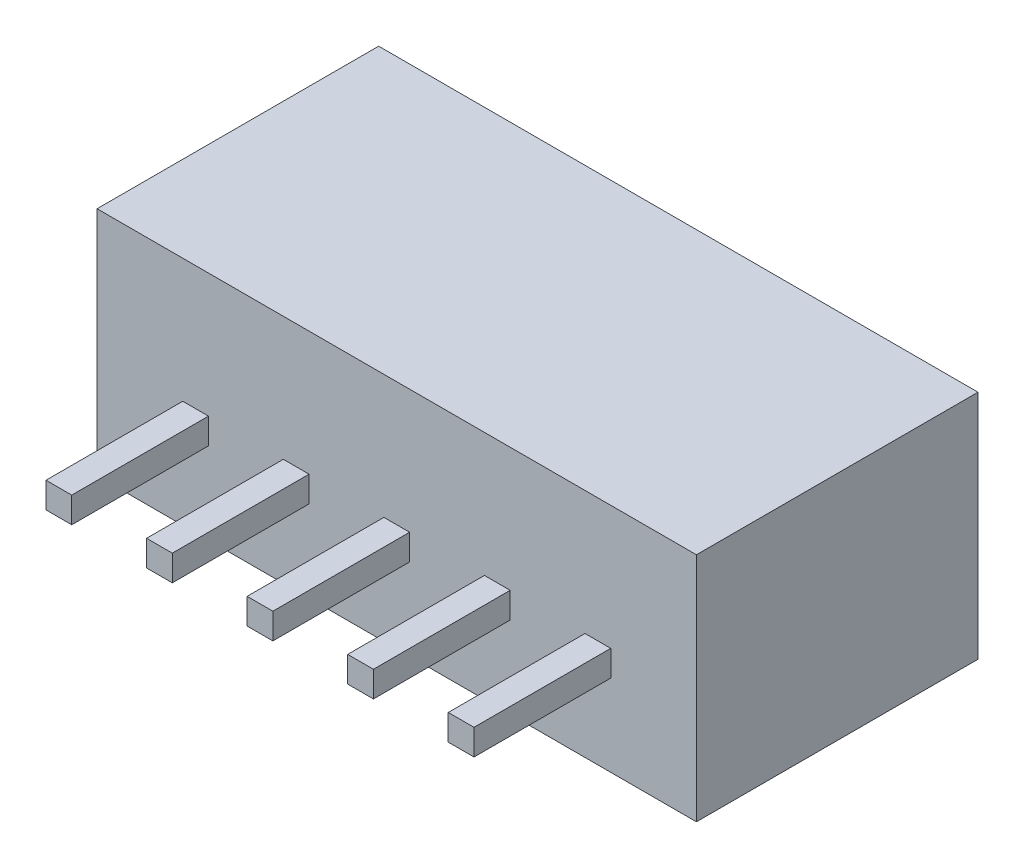
ISO-10303-21;
HEADER;
FILE_DESCRIPTION(('STEP AP214'),'2;1');
FILE_NAME('part.step','',(''),(''),'','','');
FILE_SCHEMA(('AUTOMOTIVE_DESIGN { 1 0 10303 214 1 1 1 1 }'));
ENDSEC;
DATA;
#1=APPLICATION_CONTEXT('core data for automotive mechanical design processes');
#2=APPLICATION_PROTOCOL_DEFINITION('international standard','automotive_design',2000,#1);
#3=PRODUCT_CONTEXT('',#1,'mechanical');
#4=PRODUCT('Part','Part','',(#3));
#5=PRODUCT_RELATED_PRODUCT_CATEGORY('part','',(#4));
#6=PRODUCT_DEFINITION_FORMATION('','',#4);
#7=PRODUCT_DEFINITION_CONTEXT('part definition',#1,'design');
#8=PRODUCT_DEFINITION('design','',#6,#7);
#9=PRODUCT_DEFINITION_SHAPE('','',#8);
#10=(LENGTH_UNIT() NAMED_UNIT(*) SI_UNIT(.MILLI.,.METRE.));
#11=(NAMED_UNIT(*) PLANE_ANGLE_UNIT() SI_UNIT($,.RADIAN.));
#12=(NAMED_UNIT(*) SI_UNIT($,.STERADIAN.) SOLID_ANGLE_UNIT());
#13=UNCERTAINTY_MEASURE_WITH_UNIT(LENGTH_MEASURE(1.E-05),#10,'distance_accuracy_value','');
#14=(GEOMETRIC_REPRESENTATION_CONTEXT(3) GLOBAL_UNCERTAINTY_ASSIGNED_CONTEXT((#13)) GLOBAL_UNIT_ASSIGNED_CONTEXT((#10,
#11,#12)) REPRESENTATION_CONTEXT('',''));
#15=CARTESIAN_POINT('',(0.,0.,0.));
#16=DIRECTION('',(0.,0.,1.));
#17=DIRECTION('',(1.,0.,0.));
#18=AXIS2_PLACEMENT_3D('',#15,#16,#17);
#19=CARTESIAN_POINT('',(0.,0.,7.));
#20=DIRECTION('',(0.,0.,1.));
#21=DIRECTION('',(1.,0.,0.));
#22=AXIS2_PLACEMENT_3D('',#19,#20,#21);
#23=PLANE('',#22);
#24=DIRECTION('',(-1.,0.,0.));
#25=VECTOR('',#24,1.);
#26=CARTESIAN_POINT('',(2.18,-0.204999999999995,7.));
#27=LINE('',#26,#25);
#28=CARTESIAN_POINT('',(2.82,-0.204999999999995,7.));
#29=VERTEX_POINT('',#28);
#30=CARTESIAN_POINT('',(2.18,-0.204999999999995,7.));
#31=VERTEX_POINT('',#30);
#32=EDGE_CURVE('E299',#29,#31,#27,.T.);
#33=ORIENTED_EDGE('',*,*,#32,.F.);
#34=DIRECTION('',(0.,1.,0.));
#35=VECTOR('',#34,1.);
#36=CARTESIAN_POINT('',(2.82,-0.204999999999995,7.));
#37=LINE('',#36,#35);
#38=CARTESIAN_POINT('',(2.82,-0.844999999999996,7.));
#39=VERTEX_POINT('',#38);
#40=EDGE_CURVE('E285',#39,#29,#37,.T.);
#41=ORIENTED_EDGE('',*,*,#40,.F.);
#42=DIRECTION('',(1.,0.,0.));
#43=VECTOR('',#42,1.);
#44=CARTESIAN_POINT('',(2.18,-0.844999999999996,7.));
#45=LINE('',#44,#43);
#46=CARTESIAN_POINT('',(2.18,-0.844999999999996,7.));
#47=VERTEX_POINT('',#46);
#48=EDGE_CURVE('E290',#47,#39,#45,.T.);
#49=ORIENTED_EDGE('',*,*,#48,.F.);
#50=DIRECTION('',(0.,-1.,0.));
#51=VECTOR('',#50,1.);
#52=CARTESIAN_POINT('',(2.18,-0.204999999999995,7.));
#53=LINE('',#52,#51);
#54=EDGE_CURVE('E301',#31,#47,#53,.T.);
#55=ORIENTED_EDGE('',*,*,#54,.F.);
#56=EDGE_LOOP('',(#33,#41,#49,#55));
#57=FACE_BOUND('',#56,.T.);
#58=DIRECTION('',(-1.,0.,0.));
#59=VECTOR('',#58,1.);
#60=CARTESIAN_POINT('',(-2.82,-0.204999999999995,7.));
#61=LINE('',#60,#59);
#62=CARTESIAN_POINT('',(-2.18,-0.204999999999995,7.));
#63=VERTEX_POINT('',#62);
#64=CARTESIAN_POINT('',(-2.82,-0.204999999999995,7.));
#65=VERTEX_POINT('',#64);
#66=EDGE_CURVE('E357',#63,#65,#61,.T.);
#67=ORIENTED_EDGE('',*,*,#66,.F.);
#68=DIRECTION('',(0.,1.,0.));
#69=VECTOR('',#68,1.);
#70=CARTESIAN_POINT('',(-2.18,-0.204999999999995,7.));
#71=LINE('',#70,#69);
#72=CARTESIAN_POINT('',(-2.18,-0.844999999999996,7.));
#73=VERTEX_POINT('',#72);
#74=EDGE_CURVE('E343',#73,#63,#71,.T.);
#75=ORIENTED_EDGE('',*,*,#74,.F.);
#76=DIRECTION('',(1.,0.,0.));
#77=VECTOR('',#76,1.);
#78=CARTESIAN_POINT('',(-2.82,-0.844999999999996,7.));
#79=LINE('',#78,#77);
#80=CARTESIAN_POINT('',(-2.82,-0.844999999999996,7.));
#81=VERTEX_POINT('',#80);
#82=EDGE_CURVE('E348',#81,#73,#79,.T.);
#83=ORIENTED_EDGE('',*,*,#82,.F.);
#84=DIRECTION('',(0.,-1.,0.));
#85=VECTOR('',#84,1.);
#86=CARTESIAN_POINT('',(-2.82,-0.204999999999995,7.));
#87=LINE('',#86,#85);
#88=EDGE_CURVE('E359',#65,#81,#87,.T.);
#89=ORIENTED_EDGE('',*,*,#88,.F.);
#90=EDGE_LOOP('',(#67,#75,#83,#89));
#91=FACE_BOUND('',#90,.T.);
#92=DIRECTION('',(0.,1.,0.));
#93=VECTOR('',#92,1.);
#94=CARTESIAN_POINT('',(7.45000000000001,2.875,7.));
#95=LINE('',#94,#93);
#96=CARTESIAN_POINT('',(7.45000000000001,-2.875,7.));
#97=VERTEX_POINT('',#96);
#98=CARTESIAN_POINT('',(7.45000000000001,2.875,7.));
#99=VERTEX_POINT('',#98);
#100=EDGE_CURVE('E402',#97,#99,#95,.T.);
#101=ORIENTED_EDGE('',*,*,#100,.T.);
#102=DIRECTION('',(-1.,0.,0.));
#103=VECTOR('',#102,1.);
#104=CARTESIAN_POINT('',(-7.44999999999998,2.875,7.));
#105=LINE('',#104,#103);
#106=CARTESIAN_POINT('',(-7.44999999999998,2.875,7.));
#107=VERTEX_POINT('',#106);
#108=EDGE_CURVE('E405',#99,#107,#105,.T.);
#109=ORIENTED_EDGE('',*,*,#108,.T.);
#110=DIRECTION('',(0.,-1.,0.));
#111=VECTOR('',#110,1.);
#112=CARTESIAN_POINT('',(-7.44999999999998,2.875,7.));
#113=LINE('',#112,#111);
#114=CARTESIAN_POINT('',(-7.44999999999998,-2.875,7.));
#115=VERTEX_POINT('',#114);
#116=EDGE_CURVE('E408',#107,#115,#113,.T.);
#117=ORIENTED_EDGE('',*,*,#116,.T.);
#118=DIRECTION('',(1.,0.,0.));
#119=VECTOR('',#118,1.);
#120=CARTESIAN_POINT('',(-7.44999999999998,-2.875,7.));
#121=LINE('',#120,#119);
#122=EDGE_CURVE('E410',#115,#97,#121,.T.);
#123=ORIENTED_EDGE('',*,*,#122,.T.);
#124=EDGE_LOOP('',(#101,#109,#117,#123));
#125=FACE_BOUND('',#124,.T.);
#126=DIRECTION('',(-1.,0.,0.));
#127=VECTOR('',#126,1.);
#128=CARTESIAN_POINT('',(-5.32,-0.204999999999995,7.));
#129=LINE('',#128,#127);
#130=CARTESIAN_POINT('',(-4.68,-0.204999999999995,7.));
#131=VERTEX_POINT('',#130);
#132=CARTESIAN_POINT('',(-5.32,-0.204999999999995,7.));
#133=VERTEX_POINT('',#132);
#134=EDGE_CURVE('E386',#131,#133,#129,.T.);
#135=ORIENTED_EDGE('',*,*,#134,.F.);
#136=DIRECTION('',(0.,1.,0.));
#137=VECTOR('',#136,1.);
#138=CARTESIAN_POINT('',(-4.68,-0.204999999999995,7.));
#139=LINE('',#138,#137);
#140=CARTESIAN_POINT('',(-4.68,-0.844999999999996,7.));
#141=VERTEX_POINT('',#140);
#142=EDGE_CURVE('E372',#141,#131,#139,.T.);
#143=ORIENTED_EDGE('',*,*,#142,.F.);
#144=DIRECTION('',(1.,0.,0.));
#145=VECTOR('',#144,1.);
#146=CARTESIAN_POINT('',(-5.32,-0.844999999999996,7.));
#147=LINE('',#146,#145);
#148=CARTESIAN_POINT('',(-5.32,-0.844999999999996,7.));
#149=VERTEX_POINT('',#148);
#150=EDGE_CURVE('E377',#149,#141,#147,.T.);
#151=ORIENTED_EDGE('',*,*,#150,.F.);
#152=DIRECTION('',(0.,-1.,0.));
#153=VECTOR('',#152,1.);
#154=CARTESIAN_POINT('',(-5.32,-0.204999999999995,7.));
#155=LINE('',#154,#153);
#156=EDGE_CURVE('E388',#133,#149,#155,.T.);
#157=ORIENTED_EDGE('',*,*,#156,.F.);
#158=EDGE_LOOP('',(#135,#143,#151,#157));
#159=FACE_BOUND('',#158,.T.);
#160=DIRECTION('',(-1.,0.,0.));
#161=VECTOR('',#160,1.);
#162=CARTESIAN_POINT('',(-0.32,-0.204999999999995,7.));
#163=LINE('',#162,#161);
#164=CARTESIAN_POINT('',(0.32,-0.204999999999995,7.));
#165=VERTEX_POINT('',#164);
#166=CARTESIAN_POINT('',(-0.32,-0.204999999999995,7.));
#167=VERTEX_POINT('',#166);
#168=EDGE_CURVE('E328',#165,#167,#163,.T.);
#169=ORIENTED_EDGE('',*,*,#168,.F.);
#170=DIRECTION('',(0.,1.,0.));
#171=VECTOR('',#170,1.);
#172=CARTESIAN_POINT('',(0.32,-0.204999999999995,7.));
#173=LINE('',#172,#171);
#174=CARTESIAN_POINT('',(0.32,-0.844999999999996,7.));
#175=VERTEX_POINT('',#174);
#176=EDGE_CURVE('E314',#175,#165,#173,.T.);
#177=ORIENTED_EDGE('',*,*,#176,.F.);
#178=DIRECTION('',(1.,0.,0.));
#179=VECTOR('',#178,1.);
#180=CARTESIAN_POINT('',(-0.32,-0.844999999999996,7.));
#181=LINE('',#180,#179);
#182=CARTESIAN_POINT('',(-0.32,-0.844999999999996,7.));
#183=VERTEX_POINT('',#182);
#184=EDGE_CURVE('E319',#183,#175,#181,.T.);
#185=ORIENTED_EDGE('',*,*,#184,.F.);
#186=DIRECTION('',(0.,-1.,0.));
#187=VECTOR('',#186,1.);
#188=CARTESIAN_POINT('',(-0.32,-0.204999999999995,7.));
#189=LINE('',#188,#187);
#190=EDGE_CURVE('E330',#167,#183,#189,.T.);
#191=ORIENTED_EDGE('',*,*,#190,.F.);
#192=EDGE_LOOP('',(#169,#177,#185,#191));
#193=FACE_BOUND('',#192,.T.);
#194=DIRECTION('',(-1.,0.,0.));
#195=VECTOR('',#194,1.);
#196=CARTESIAN_POINT('',(4.68,-0.204999999999995,7.));
#197=LINE('',#196,#195);
#198=CARTESIAN_POINT('',(5.32,-0.204999999999995,7.));
#199=VERTEX_POINT('',#198);
#200=CARTESIAN_POINT('',(4.68,-0.204999999999995,7.));
#201=VERTEX_POINT('',#200);
#202=EDGE_CURVE('E272',#199,#201,#197,.T.);
#203=ORIENTED_EDGE('',*,*,#202,.F.);
#204=DIRECTION('',(0.,1.,0.));
#205=VECTOR('',#204,1.);
#206=CARTESIAN_POINT('',(5.32,-0.204999999999995,7.));
#207=LINE('',#206,#205);
#208=CARTESIAN_POINT('',(5.32,-0.844999999999996,7.));
#209=VERTEX_POINT('',#208);
#210=EDGE_CURVE('E255',#209,#199,#207,.T.);
#211=ORIENTED_EDGE('',*,*,#210,.F.);
#212=DIRECTION('',(1.,0.,0.));
#213=VECTOR('',#212,1.);
#214=CARTESIAN_POINT('',(4.68,-0.844999999999996,7.));
#215=LINE('',#214,#213);
#216=CARTESIAN_POINT('',(4.68,-0.844999999999996,7.));
#217=VERTEX_POINT('',#216);
#218=EDGE_CURVE('E263',#217,#209,#215,.T.);
#219=ORIENTED_EDGE('',*,*,#218,.F.);
#220=DIRECTION('',(0.,-1.,0.));
#221=VECTOR('',#220,1.);
#222=CARTESIAN_POINT('',(4.68,-0.204999999999995,7.));
#223=LINE('',#222,#221);
#224=EDGE_CURVE('E274',#201,#217,#223,.T.);
#225=ORIENTED_EDGE('',*,*,#224,.F.);
#226=EDGE_LOOP('',(#203,#211,#219,#225));
#227=FACE_BOUND('',#226,.T.);
#228=ADVANCED_FACE('F34',(#57,#91,#125,#159,#193,#227),#23,.T.);
#229=CARTESIAN_POINT('',(7.45000000000001,2.875,7.));
#230=DIRECTION('',(-1.,0.,0.));
#231=DIRECTION('',(0.,0.,1.));
#232=AXIS2_PLACEMENT_3D('',#229,#230,#231);
#233=PLANE('',#232);
#234=DIRECTION('',(0.,1.,0.));
#235=VECTOR('',#234,1.);
#236=CARTESIAN_POINT('',(7.45000000000001,2.875,0.));
#237=LINE('',#236,#235);
#238=CARTESIAN_POINT('',(7.45000000000001,-2.875,0.));
#239=VERTEX_POINT('',#238);
#240=CARTESIAN_POINT('',(7.45000000000001,2.875,0.));
#241=VERTEX_POINT('',#240);
#242=EDGE_CURVE('E401',#239,#241,#237,.T.);
#243=ORIENTED_EDGE('',*,*,#242,.T.);
#244=DIRECTION('',(0.,0.,-1.));
#245=VECTOR('',#244,1.);
#246=CARTESIAN_POINT('',(7.45000000000001,2.875,7.));
#247=LINE('',#246,#245);
#248=EDGE_CURVE('E11',#99,#241,#247,.T.);
#249=ORIENTED_EDGE('',*,*,#248,.F.);
#250=ORIENTED_EDGE('',*,*,#100,.F.);
#251=DIRECTION('',(0.,0.,-1.));
#252=VECTOR('',#251,1.);
#253=CARTESIAN_POINT('',(7.45000000000001,-2.875,7.));
#254=LINE('',#253,#252);
#255=EDGE_CURVE('E412',#97,#239,#254,.T.);
#256=ORIENTED_EDGE('',*,*,#255,.T.);
#257=EDGE_LOOP('',(#243,#249,#250,#256));
#258=FACE_BOUND('',#257,.T.);
#259=ADVANCED_FACE('F36',(#258),#233,.F.);
#260=CARTESIAN_POINT('',(-7.44999999999998,2.875,7.));
#261=DIRECTION('',(0.,-1.,0.));
#262=DIRECTION('',(0.,0.,-1.));
#263=AXIS2_PLACEMENT_3D('',#260,#261,#262);
#264=PLANE('',#263);
#265=DIRECTION('',(-1.,0.,0.));
#266=VECTOR('',#265,1.);
#267=CARTESIAN_POINT('',(-7.44999999999998,2.875,0.));
#268=LINE('',#267,#266);
#269=CARTESIAN_POINT('',(-7.44999999999998,2.875,0.));
#270=VERTEX_POINT('',#269);
#271=EDGE_CURVE('E415',#241,#270,#268,.T.);
#272=ORIENTED_EDGE('',*,*,#271,.T.);
#273=DIRECTION('',(0.,0.,-1.));
#274=VECTOR('',#273,1.);
#275=CARTESIAN_POINT('',(-7.44999999999998,2.875,7.));
#276=LINE('',#275,#274);
#277=EDGE_CURVE('E42',#107,#270,#276,.T.);
#278=ORIENTED_EDGE('',*,*,#277,.F.);
#279=ORIENTED_EDGE('',*,*,#108,.F.);
#280=ORIENTED_EDGE('',*,*,#248,.T.);
#281=EDGE_LOOP('',(#272,#278,#279,#280));
#282=FACE_BOUND('',#281,.T.);
#283=ADVANCED_FACE('F445',(#282),#264,.F.);
#284=CARTESIAN_POINT('',(-7.44999999999998,2.875,7.));
#285=DIRECTION('',(1.,0.,0.));
#286=DIRECTION('',(0.,0.,-1.));
#287=AXIS2_PLACEMENT_3D('',#284,#285,#286);
#288=PLANE('',#287);
#289=DIRECTION('',(0.,-1.,0.));
#290=VECTOR('',#289,1.);
#291=CARTESIAN_POINT('',(-7.44999999999998,2.875,0.));
#292=LINE('',#291,#290);
#293=CARTESIAN_POINT('',(-7.44999999999998,-2.875,0.));
#294=VERTEX_POINT('',#293);
#295=EDGE_CURVE('E417',#270,#294,#292,.T.);
#296=ORIENTED_EDGE('',*,*,#295,.T.);
#297=DIRECTION('',(0.,0.,-1.));
#298=VECTOR('',#297,1.);
#299=CARTESIAN_POINT('',(-7.44999999999998,-2.875,7.));
#300=LINE('',#299,#298);
#301=EDGE_CURVE('E422',#115,#294,#300,.T.);
#302=ORIENTED_EDGE('',*,*,#301,.F.);
#303=ORIENTED_EDGE('',*,*,#116,.F.);
#304=ORIENTED_EDGE('',*,*,#277,.T.);
#305=EDGE_LOOP('',(#296,#302,#303,#304));
#306=FACE_BOUND('',#305,.T.);
#307=ADVANCED_FACE('F429',(#306),#288,.F.);
#308=CARTESIAN_POINT('',(-7.44999999999998,-2.875,7.));
#309=DIRECTION('',(0.,1.,0.));
#310=DIRECTION('',(0.,0.,1.));
#311=AXIS2_PLACEMENT_3D('',#308,#309,#310);
#312=PLANE('',#311);
#313=DIRECTION('',(1.,0.,0.));
#314=VECTOR('',#313,1.);
#315=CARTESIAN_POINT('',(-7.44999999999998,-2.875,0.));
#316=LINE('',#315,#314);
#317=EDGE_CURVE('E406',#294,#239,#316,.T.);
#318=ORIENTED_EDGE('',*,*,#317,.T.);
#319=ORIENTED_EDGE('',*,*,#255,.F.);
#320=ORIENTED_EDGE('',*,*,#122,.F.);
#321=ORIENTED_EDGE('',*,*,#301,.T.);
#322=EDGE_LOOP('',(#318,#319,#320,#321));
#323=FACE_BOUND('',#322,.T.);
#324=ADVANCED_FACE('F438',(#323),#312,.F.);
#325=CARTESIAN_POINT('',(0.,0.,0.));
#326=DIRECTION('',(0.,0.,1.));
#327=DIRECTION('',(1.,0.,0.));
#328=AXIS2_PLACEMENT_3D('',#325,#326,#327);
#329=PLANE('',#328);
#330=DIRECTION('',(0.,-1.,0.));
#331=VECTOR('',#330,1.);
#332=CARTESIAN_POINT('',(6.45000000000001,1.875,0.));
#333=LINE('',#332,#331);
#334=CARTESIAN_POINT('',(6.45000000000001,1.875,0.));
#335=VERTEX_POINT('',#334);
#336=CARTESIAN_POINT('',(6.45000000000001,-1.875,0.));
#337=VERTEX_POINT('',#336);
#338=EDGE_CURVE('E249',#335,#337,#333,.T.);
#339=ORIENTED_EDGE('',*,*,#338,.F.);
#340=DIRECTION('',(1.,0.,0.));
#341=VECTOR('',#340,1.);
#342=CARTESIAN_POINT('',(-6.44999999999998,1.875,0.));
#343=LINE('',#342,#341);
#344=CARTESIAN_POINT('',(-6.44999999999998,1.875,0.));
#345=VERTEX_POINT('',#344);
#346=EDGE_CURVE('E49',#345,#335,#343,.T.);
#347=ORIENTED_EDGE('',*,*,#346,.F.);
#348=DIRECTION('',(0.,1.,0.));
#349=VECTOR('',#348,1.);
#350=CARTESIAN_POINT('',(-6.44999999999998,-1.875,0.));
#351=LINE('',#350,#349);
#352=CARTESIAN_POINT('',(-6.44999999999998,-1.875,0.));
#353=VERTEX_POINT('',#352);
#354=EDGE_CURVE('E240',#353,#345,#351,.T.);
#355=ORIENTED_EDGE('',*,*,#354,.F.);
#356=DIRECTION('',(-1.,0.,0.));
#357=VECTOR('',#356,1.);
#358=CARTESIAN_POINT('',(6.45000000000001,-1.875,0.));
#359=LINE('',#358,#357);
#360=EDGE_CURVE('E243',#337,#353,#359,.T.);
#361=ORIENTED_EDGE('',*,*,#360,.F.);
#362=EDGE_LOOP('',(#339,#347,#355,#361));
#363=FACE_BOUND('',#362,.T.);
#364=ORIENTED_EDGE('',*,*,#242,.F.);
#365=ORIENTED_EDGE('',*,*,#317,.F.);
#366=ORIENTED_EDGE('',*,*,#295,.F.);
#367=ORIENTED_EDGE('',*,*,#271,.F.);
#368=EDGE_LOOP('',(#364,#365,#366,#367));
#369=FACE_BOUND('',#368,.T.);
#370=ADVANCED_FACE('F435',(#363,#369),#329,.F.);
#371=CARTESIAN_POINT('',(-4.68,-0.204999999999995,10.4));
#372=DIRECTION('',(-1.,0.,0.));
#373=DIRECTION('',(0.,0.,1.));
#374=AXIS2_PLACEMENT_3D('',#371,#372,#373);
#375=PLANE('',#374);
#376=ORIENTED_EDGE('',*,*,#142,.T.);
#377=DIRECTION('',(0.,0.,-1.));
#378=VECTOR('',#377,1.);
#379=CARTESIAN_POINT('',(-4.68,-0.204999999999995,10.4));
#380=LINE('',#379,#378);
#381=CARTESIAN_POINT('',(-4.68,-0.204999999999995,10.4));
#382=VERTEX_POINT('',#381);
#383=EDGE_CURVE('E399',#382,#131,#380,.T.);
#384=ORIENTED_EDGE('',*,*,#383,.F.);
#385=DIRECTION('',(0.,1.,0.));
#386=VECTOR('',#385,1.);
#387=CARTESIAN_POINT('',(-4.68,-0.204999999999995,10.4));
#388=LINE('',#387,#386);
#389=CARTESIAN_POINT('',(-4.68,-0.844999999999996,10.4));
#390=VERTEX_POINT('',#389);
#391=EDGE_CURVE('E373',#390,#382,#388,.T.);
#392=ORIENTED_EDGE('',*,*,#391,.F.);
#393=DIRECTION('',(0.,0.,-1.));
#394=VECTOR('',#393,1.);
#395=CARTESIAN_POINT('',(-4.68,-0.844999999999996,10.4));
#396=LINE('',#395,#394);
#397=EDGE_CURVE('E383',#390,#141,#396,.T.);
#398=ORIENTED_EDGE('',*,*,#397,.T.);
#399=EDGE_LOOP('',(#376,#384,#392,#398));
#400=FACE_BOUND('',#399,.T.);
#401=ADVANCED_FACE('F461',(#400),#375,.F.);
#402=CARTESIAN_POINT('',(-5.32,-0.204999999999995,10.4));
#403=DIRECTION('',(0.,-1.,0.));
#404=DIRECTION('',(0.,0.,-1.));
#405=AXIS2_PLACEMENT_3D('',#402,#403,#404);
#406=PLANE('',#405);
#407=ORIENTED_EDGE('',*,*,#134,.T.);
#408=DIRECTION('',(0.,0.,-1.));
#409=VECTOR('',#408,1.);
#410=CARTESIAN_POINT('',(-5.32,-0.204999999999995,10.4));
#411=LINE('',#410,#409);
#412=CARTESIAN_POINT('',(-5.32,-0.204999999999995,10.4));
#413=VERTEX_POINT('',#412);
#414=EDGE_CURVE('E396',#413,#133,#411,.T.);
#415=ORIENTED_EDGE('',*,*,#414,.F.);
#416=DIRECTION('',(-1.,0.,0.));
#417=VECTOR('',#416,1.);
#418=CARTESIAN_POINT('',(-5.32,-0.204999999999995,10.4));
#419=LINE('',#418,#417);
#420=EDGE_CURVE('E376',#382,#413,#419,.T.);
#421=ORIENTED_EDGE('',*,*,#420,.F.);
#422=ORIENTED_EDGE('',*,*,#383,.T.);
#423=EDGE_LOOP('',(#407,#415,#421,#422));
#424=FACE_BOUND('',#423,.T.);
#425=ADVANCED_FACE('F483',(#424),#406,.F.);
#426=CARTESIAN_POINT('',(-5.32,-0.204999999999995,10.4));
#427=DIRECTION('',(1.,0.,0.));
#428=DIRECTION('',(0.,0.,-1.));
#429=AXIS2_PLACEMENT_3D('',#426,#427,#428);
#430=PLANE('',#429);
#431=ORIENTED_EDGE('',*,*,#156,.T.);
#432=DIRECTION('',(0.,0.,-1.));
#433=VECTOR('',#432,1.);
#434=CARTESIAN_POINT('',(-5.32,-0.844999999999996,10.4));
#435=LINE('',#434,#433);
#436=CARTESIAN_POINT('',(-5.32,-0.844999999999996,10.4));
#437=VERTEX_POINT('',#436);
#438=EDGE_CURVE('E394',#437,#149,#435,.T.);
#439=ORIENTED_EDGE('',*,*,#438,.F.);
#440=DIRECTION('',(0.,-1.,0.));
#441=VECTOR('',#440,1.);
#442=CARTESIAN_POINT('',(-5.32,-0.204999999999995,10.4));
#443=LINE('',#442,#441);
#444=EDGE_CURVE('E379',#413,#437,#443,.T.);
#445=ORIENTED_EDGE('',*,*,#444,.F.);
#446=ORIENTED_EDGE('',*,*,#414,.T.);
#447=EDGE_LOOP('',(#431,#439,#445,#446));
#448=FACE_BOUND('',#447,.T.);
#449=ADVANCED_FACE('F490',(#448),#430,.F.);
#450=CARTESIAN_POINT('',(-5.32,-0.844999999999996,10.4));
#451=DIRECTION('',(0.,1.,0.));
#452=DIRECTION('',(0.,0.,1.));
#453=AXIS2_PLACEMENT_3D('',#450,#451,#452);
#454=PLANE('',#453);
#455=ORIENTED_EDGE('',*,*,#150,.T.);
#456=ORIENTED_EDGE('',*,*,#397,.F.);
#457=DIRECTION('',(1.,0.,0.));
#458=VECTOR('',#457,1.);
#459=CARTESIAN_POINT('',(-5.32,-0.844999999999996,10.4));
#460=LINE('',#459,#458);
#461=EDGE_CURVE('E381',#437,#390,#460,.T.);
#462=ORIENTED_EDGE('',*,*,#461,.F.);
#463=ORIENTED_EDGE('',*,*,#438,.T.);
#464=EDGE_LOOP('',(#455,#456,#462,#463));
#465=FACE_BOUND('',#464,.T.);
#466=ADVANCED_FACE('F497',(#465),#454,.F.);
#467=CARTESIAN_POINT('',(0.,0.,10.4));
#468=DIRECTION('',(0.,0.,1.));
#469=DIRECTION('',(1.,0.,0.));
#470=AXIS2_PLACEMENT_3D('',#467,#468,#469);
#471=PLANE('',#470);
#472=ORIENTED_EDGE('',*,*,#391,.T.);
#473=ORIENTED_EDGE('',*,*,#420,.T.);
#474=ORIENTED_EDGE('',*,*,#444,.T.);
#475=ORIENTED_EDGE('',*,*,#461,.T.);
#476=EDGE_LOOP('',(#472,#473,#474,#475));
#477=FACE_BOUND('',#476,.T.);
#478=ADVANCED_FACE('F505',(#477),#471,.T.);
#479=CARTESIAN_POINT('',(-2.18,-0.204999999999995,10.4));
#480=DIRECTION('',(-1.,0.,0.));
#481=DIRECTION('',(0.,0.,1.));
#482=AXIS2_PLACEMENT_3D('',#479,#480,#481);
#483=PLANE('',#482);
#484=ORIENTED_EDGE('',*,*,#74,.T.);
#485=DIRECTION('',(0.,0.,-1.));
#486=VECTOR('',#485,1.);
#487=CARTESIAN_POINT('',(-2.18,-0.204999999999995,10.4));
#488=LINE('',#487,#486);
#489=CARTESIAN_POINT('',(-2.18,-0.204999999999995,10.4));
#490=VERTEX_POINT('',#489);
#491=EDGE_CURVE('E370',#490,#63,#488,.T.);
#492=ORIENTED_EDGE('',*,*,#491,.F.);
#493=DIRECTION('',(0.,1.,0.));
#494=VECTOR('',#493,1.);
#495=CARTESIAN_POINT('',(-2.18,-0.204999999999995,10.4));
#496=LINE('',#495,#494);
#497=CARTESIAN_POINT('',(-2.18,-0.844999999999996,10.4));
#498=VERTEX_POINT('',#497);
#499=EDGE_CURVE('E344',#498,#490,#496,.T.);
#500=ORIENTED_EDGE('',*,*,#499,.F.);
#501=DIRECTION('',(0.,0.,-1.));
#502=VECTOR('',#501,1.);
#503=CARTESIAN_POINT('',(-2.18,-0.844999999999996,10.4));
#504=LINE('',#503,#502);
#505=EDGE_CURVE('E354',#498,#73,#504,.T.);
#506=ORIENTED_EDGE('',*,*,#505,.T.);
#507=EDGE_LOOP('',(#484,#492,#500,#506));
#508=FACE_BOUND('',#507,.T.);
#509=ADVANCED_FACE('F513',(#508),#483,.F.);
#510=CARTESIAN_POINT('',(-2.82,-0.204999999999995,10.4));
#511=DIRECTION('',(0.,-1.,0.));
#512=DIRECTION('',(0.,0.,-1.));
#513=AXIS2_PLACEMENT_3D('',#510,#511,#512);
#514=PLANE('',#513);
#515=ORIENTED_EDGE('',*,*,#66,.T.);
#516=DIRECTION('',(0.,0.,-1.));
#517=VECTOR('',#516,1.);
#518=CARTESIAN_POINT('',(-2.82,-0.204999999999995,10.4));
#519=LINE('',#518,#517);
#520=CARTESIAN_POINT('',(-2.82,-0.204999999999995,10.4));
#521=VERTEX_POINT('',#520);
#522=EDGE_CURVE('E367',#521,#65,#519,.T.);
#523=ORIENTED_EDGE('',*,*,#522,.F.);
#524=DIRECTION('',(-1.,0.,0.));
#525=VECTOR('',#524,1.);
#526=CARTESIAN_POINT('',(-2.82,-0.204999999999995,10.4));
#527=LINE('',#526,#525);
#528=EDGE_CURVE('E347',#490,#521,#527,.T.);
#529=ORIENTED_EDGE('',*,*,#528,.F.);
#530=ORIENTED_EDGE('',*,*,#491,.T.);
#531=EDGE_LOOP('',(#515,#523,#529,#530));
#532=FACE_BOUND('',#531,.T.);
#533=ADVANCED_FACE('F521',(#532),#514,.F.);
#534=CARTESIAN_POINT('',(-2.82,-0.204999999999995,10.4));
#535=DIRECTION('',(1.,0.,0.));
#536=DIRECTION('',(0.,0.,-1.));
#537=AXIS2_PLACEMENT_3D('',#534,#535,#536);
#538=PLANE('',#537);
#539=ORIENTED_EDGE('',*,*,#88,.T.);
#540=DIRECTION('',(0.,0.,-1.));
#541=VECTOR('',#540,1.);
#542=CARTESIAN_POINT('',(-2.82,-0.844999999999996,10.4));
#543=LINE('',#542,#541);
#544=CARTESIAN_POINT('',(-2.82,-0.844999999999996,10.4));
#545=VERTEX_POINT('',#544);
#546=EDGE_CURVE('E365',#545,#81,#543,.T.);
#547=ORIENTED_EDGE('',*,*,#546,.F.);
#548=DIRECTION('',(0.,-1.,0.));
#549=VECTOR('',#548,1.);
#550=CARTESIAN_POINT('',(-2.82,-0.204999999999995,10.4));
#551=LINE('',#550,#549);
#552=EDGE_CURVE('E350',#521,#545,#551,.T.);
#553=ORIENTED_EDGE('',*,*,#552,.F.);
#554=ORIENTED_EDGE('',*,*,#522,.T.);
#555=EDGE_LOOP('',(#539,#547,#553,#554));
#556=FACE_BOUND('',#555,.T.);
#557=ADVANCED_FACE('F529',(#556),#538,.F.);
#558=CARTESIAN_POINT('',(-2.82,-0.844999999999996,10.4));
#559=DIRECTION('',(0.,1.,0.));
#560=DIRECTION('',(0.,0.,1.));
#561=AXIS2_PLACEMENT_3D('',#558,#559,#560);
#562=PLANE('',#561);
#563=ORIENTED_EDGE('',*,*,#82,.T.);
#564=ORIENTED_EDGE('',*,*,#505,.F.);
#565=DIRECTION('',(1.,0.,0.));
#566=VECTOR('',#565,1.);
#567=CARTESIAN_POINT('',(-2.82,-0.844999999999996,10.4));
#568=LINE('',#567,#566);
#569=EDGE_CURVE('E352',#545,#498,#568,.T.);
#570=ORIENTED_EDGE('',*,*,#569,.F.);
#571=ORIENTED_EDGE('',*,*,#546,.T.);
#572=EDGE_LOOP('',(#563,#564,#570,#571));
#573=FACE_BOUND('',#572,.T.);
#574=ADVANCED_FACE('F537',(#573),#562,.F.);
#575=CARTESIAN_POINT('',(0.,0.,10.4));
#576=DIRECTION('',(0.,0.,1.));
#577=DIRECTION('',(1.,0.,0.));
#578=AXIS2_PLACEMENT_3D('',#575,#576,#577);
#579=PLANE('',#578);
#580=ORIENTED_EDGE('',*,*,#499,.T.);
#581=ORIENTED_EDGE('',*,*,#528,.T.);
#582=ORIENTED_EDGE('',*,*,#552,.T.);
#583=ORIENTED_EDGE('',*,*,#569,.T.);
#584=EDGE_LOOP('',(#580,#581,#582,#583));
#585=FACE_BOUND('',#584,.T.);
#586=ADVANCED_FACE('F545',(#585),#579,.T.);
#587=CARTESIAN_POINT('',(0.32,-0.204999999999995,10.4));
#588=DIRECTION('',(-1.,0.,0.));
#589=DIRECTION('',(0.,-1.,0.));
#590=AXIS2_PLACEMENT_3D('',#587,#588,#589);
#591=PLANE('',#590);
#592=ORIENTED_EDGE('',*,*,#176,.T.);
#593=DIRECTION('',(0.,0.,-1.));
#594=VECTOR('',#593,1.);
#595=CARTESIAN_POINT('',(0.32,-0.204999999999995,10.4));
#596=LINE('',#595,#594);
#597=CARTESIAN_POINT('',(0.32,-0.204999999999995,10.4));
#598=VERTEX_POINT('',#597);
#599=EDGE_CURVE('E341',#598,#165,#596,.T.);
#600=ORIENTED_EDGE('',*,*,#599,.F.);
#601=DIRECTION('',(0.,1.,0.));
#602=VECTOR('',#601,1.);
#603=CARTESIAN_POINT('',(0.32,-0.204999999999995,10.4));
#604=LINE('',#603,#602);
#605=CARTESIAN_POINT('',(0.32,-0.844999999999996,10.4));
#606=VERTEX_POINT('',#605);
#607=EDGE_CURVE('E315',#606,#598,#604,.T.);
#608=ORIENTED_EDGE('',*,*,#607,.F.);
#609=DIRECTION('',(0.,0.,-1.));
#610=VECTOR('',#609,1.);
#611=CARTESIAN_POINT('',(0.32,-0.844999999999996,10.4));
#612=LINE('',#611,#610);
#613=EDGE_CURVE('E325',#606,#175,#612,.T.);
#614=ORIENTED_EDGE('',*,*,#613,.T.);
#615=EDGE_LOOP('',(#592,#600,#608,#614));
#616=FACE_BOUND('',#615,.T.);
#617=ADVANCED_FACE('F553',(#616),#591,.F.);
#618=CARTESIAN_POINT('',(-0.32,-0.204999999999995,10.4));
#619=DIRECTION('',(0.,-1.,0.));
#620=DIRECTION('',(0.,0.,-1.));
#621=AXIS2_PLACEMENT_3D('',#618,#619,#620);
#622=PLANE('',#621);
#623=ORIENTED_EDGE('',*,*,#168,.T.);
#624=DIRECTION('',(0.,0.,-1.));
#625=VECTOR('',#624,1.);
#626=CARTESIAN_POINT('',(-0.32,-0.204999999999995,10.4));
#627=LINE('',#626,#625);
#628=CARTESIAN_POINT('',(-0.32,-0.204999999999995,10.4));
#629=VERTEX_POINT('',#628);
#630=EDGE_CURVE('E338',#629,#167,#627,.T.);
#631=ORIENTED_EDGE('',*,*,#630,.F.);
#632=DIRECTION('',(-1.,0.,0.));
#633=VECTOR('',#632,1.);
#634=CARTESIAN_POINT('',(-0.32,-0.204999999999995,10.4));
#635=LINE('',#634,#633);
#636=EDGE_CURVE('E318',#598,#629,#635,.T.);
#637=ORIENTED_EDGE('',*,*,#636,.F.);
#638=ORIENTED_EDGE('',*,*,#599,.T.);
#639=EDGE_LOOP('',(#623,#631,#637,#638));
#640=FACE_BOUND('',#639,.T.);
#641=ADVANCED_FACE('F561',(#640),#622,.F.);
#642=CARTESIAN_POINT('',(-0.32,-0.204999999999995,10.4));
#643=DIRECTION('',(1.,0.,0.));
#644=DIRECTION('',(0.,1.,0.));
#645=AXIS2_PLACEMENT_3D('',#642,#643,#644);
#646=PLANE('',#645);
#647=ORIENTED_EDGE('',*,*,#190,.T.);
#648=DIRECTION('',(0.,0.,-1.));
#649=VECTOR('',#648,1.);
#650=CARTESIAN_POINT('',(-0.32,-0.844999999999996,10.4));
#651=LINE('',#650,#649);
#652=CARTESIAN_POINT('',(-0.32,-0.844999999999996,10.4));
#653=VERTEX_POINT('',#652);
#654=EDGE_CURVE('E336',#653,#183,#651,.T.);
#655=ORIENTED_EDGE('',*,*,#654,.F.);
#656=DIRECTION('',(0.,-1.,0.));
#657=VECTOR('',#656,1.);
#658=CARTESIAN_POINT('',(-0.32,-0.204999999999995,10.4));
#659=LINE('',#658,#657);
#660=EDGE_CURVE('E321',#629,#653,#659,.T.);
#661=ORIENTED_EDGE('',*,*,#660,.F.);
#662=ORIENTED_EDGE('',*,*,#630,.T.);
#663=EDGE_LOOP('',(#647,#655,#661,#662));
#664=FACE_BOUND('',#663,.T.);
#665=ADVANCED_FACE('F569',(#664),#646,.F.);
#666=CARTESIAN_POINT('',(-0.32,-0.844999999999996,10.4));
#667=DIRECTION('',(0.,1.,0.));
#668=DIRECTION('',(0.,0.,1.));
#669=AXIS2_PLACEMENT_3D('',#666,#667,#668);
#670=PLANE('',#669);
#671=ORIENTED_EDGE('',*,*,#184,.T.);
#672=ORIENTED_EDGE('',*,*,#613,.F.);
#673=DIRECTION('',(1.,0.,0.));
#674=VECTOR('',#673,1.);
#675=CARTESIAN_POINT('',(-0.32,-0.844999999999996,10.4));
#676=LINE('',#675,#674);
#677=EDGE_CURVE('E323',#653,#606,#676,.T.);
#678=ORIENTED_EDGE('',*,*,#677,.F.);
#679=ORIENTED_EDGE('',*,*,#654,.T.);
#680=EDGE_LOOP('',(#671,#672,#678,#679));
#681=FACE_BOUND('',#680,.T.);
#682=ADVANCED_FACE('F577',(#681),#670,.F.);
#683=CARTESIAN_POINT('',(0.,0.,10.4));
#684=DIRECTION('',(0.,0.,1.));
#685=DIRECTION('',(1.,0.,0.));
#686=AXIS2_PLACEMENT_3D('',#683,#684,#685);
#687=PLANE('',#686);
#688=ORIENTED_EDGE('',*,*,#607,.T.);
#689=ORIENTED_EDGE('',*,*,#636,.T.);
#690=ORIENTED_EDGE('',*,*,#660,.T.);
#691=ORIENTED_EDGE('',*,*,#677,.T.);
#692=EDGE_LOOP('',(#688,#689,#690,#691));
#693=FACE_BOUND('',#692,.T.);
#694=ADVANCED_FACE('F585',(#693),#687,.T.);
#695=CARTESIAN_POINT('',(2.82,-0.204999999999995,10.4));
#696=DIRECTION('',(-1.,0.,0.));
#697=DIRECTION('',(0.,0.,1.));
#698=AXIS2_PLACEMENT_3D('',#695,#696,#697);
#699=PLANE('',#698);
#700=ORIENTED_EDGE('',*,*,#40,.T.);
#701=DIRECTION('',(0.,0.,-1.));
#702=VECTOR('',#701,1.);
#703=CARTESIAN_POINT('',(2.82,-0.204999999999995,10.4));
#704=LINE('',#703,#702);
#705=CARTESIAN_POINT('',(2.82,-0.204999999999995,10.4));
#706=VERTEX_POINT('',#705);
#707=EDGE_CURVE('E312',#706,#29,#704,.T.);
#708=ORIENTED_EDGE('',*,*,#707,.F.);
#709=DIRECTION('',(0.,1.,0.));
#710=VECTOR('',#709,1.);
#711=CARTESIAN_POINT('',(2.82,-0.204999999999995,10.4));
#712=LINE('',#711,#710);
#713=CARTESIAN_POINT('',(2.82,-0.844999999999996,10.4));
#714=VERTEX_POINT('',#713);
#715=EDGE_CURVE('E286',#714,#706,#712,.T.);
#716=ORIENTED_EDGE('',*,*,#715,.F.);
#717=DIRECTION('',(0.,0.,-1.));
#718=VECTOR('',#717,1.);
#719=CARTESIAN_POINT('',(2.82,-0.844999999999996,10.4));
#720=LINE('',#719,#718);
#721=EDGE_CURVE('E296',#714,#39,#720,.T.);
#722=ORIENTED_EDGE('',*,*,#721,.T.);
#723=EDGE_LOOP('',(#700,#708,#716,#722));
#724=FACE_BOUND('',#723,.T.);
#725=ADVANCED_FACE('F593',(#724),#699,.F.);
#726=CARTESIAN_POINT('',(2.18,-0.204999999999995,10.4));
#727=DIRECTION('',(0.,-1.,0.));
#728=DIRECTION('',(0.,0.,-1.));
#729=AXIS2_PLACEMENT_3D('',#726,#727,#728);
#730=PLANE('',#729);
#731=ORIENTED_EDGE('',*,*,#32,.T.);
#732=DIRECTION('',(0.,0.,-1.));
#733=VECTOR('',#732,1.);
#734=CARTESIAN_POINT('',(2.18,-0.204999999999995,10.4));
#735=LINE('',#734,#733);
#736=CARTESIAN_POINT('',(2.18,-0.204999999999995,10.4));
#737=VERTEX_POINT('',#736);
#738=EDGE_CURVE('E309',#737,#31,#735,.T.);
#739=ORIENTED_EDGE('',*,*,#738,.F.);
#740=DIRECTION('',(-1.,0.,0.));
#741=VECTOR('',#740,1.);
#742=CARTESIAN_POINT('',(2.18,-0.204999999999995,10.4));
#743=LINE('',#742,#741);
#744=EDGE_CURVE('E289',#706,#737,#743,.T.);
#745=ORIENTED_EDGE('',*,*,#744,.F.);
#746=ORIENTED_EDGE('',*,*,#707,.T.);
#747=EDGE_LOOP('',(#731,#739,#745,#746));
#748=FACE_BOUND('',#747,.T.);
#749=ADVANCED_FACE('F601',(#748),#730,.F.);
#750=CARTESIAN_POINT('',(2.18,-0.204999999999995,10.4));
#751=DIRECTION('',(1.,0.,0.));
#752=DIRECTION('',(0.,0.,-1.));
#753=AXIS2_PLACEMENT_3D('',#750,#751,#752);
#754=PLANE('',#753);
#755=ORIENTED_EDGE('',*,*,#54,.T.);
#756=DIRECTION('',(0.,0.,-1.));
#757=VECTOR('',#756,1.);
#758=CARTESIAN_POINT('',(2.18,-0.844999999999996,10.4));
#759=LINE('',#758,#757);
#760=CARTESIAN_POINT('',(2.18,-0.844999999999996,10.4));
#761=VERTEX_POINT('',#760);
#762=EDGE_CURVE('E307',#761,#47,#759,.T.);
#763=ORIENTED_EDGE('',*,*,#762,.F.);
#764=DIRECTION('',(0.,-1.,0.));
#765=VECTOR('',#764,1.);
#766=CARTESIAN_POINT('',(2.18,-0.204999999999995,10.4));
#767=LINE('',#766,#765);
#768=EDGE_CURVE('E292',#737,#761,#767,.T.);
#769=ORIENTED_EDGE('',*,*,#768,.F.);
#770=ORIENTED_EDGE('',*,*,#738,.T.);
#771=EDGE_LOOP('',(#755,#763,#769,#770));
#772=FACE_BOUND('',#771,.T.);
#773=ADVANCED_FACE('F609',(#772),#754,.F.);
#774=CARTESIAN_POINT('',(2.18,-0.844999999999996,10.4));
#775=DIRECTION('',(0.,1.,0.));
#776=DIRECTION('',(0.,0.,1.));
#777=AXIS2_PLACEMENT_3D('',#774,#775,#776);
#778=PLANE('',#777);
#779=ORIENTED_EDGE('',*,*,#48,.T.);
#780=ORIENTED_EDGE('',*,*,#721,.F.);
#781=DIRECTION('',(1.,0.,0.));
#782=VECTOR('',#781,1.);
#783=CARTESIAN_POINT('',(2.18,-0.844999999999996,10.4));
#784=LINE('',#783,#782);
#785=EDGE_CURVE('E294',#761,#714,#784,.T.);
#786=ORIENTED_EDGE('',*,*,#785,.F.);
#787=ORIENTED_EDGE('',*,*,#762,.T.);
#788=EDGE_LOOP('',(#779,#780,#786,#787));
#789=FACE_BOUND('',#788,.T.);
#790=ADVANCED_FACE('F617',(#789),#778,.F.);
#791=CARTESIAN_POINT('',(0.,0.,10.4));
#792=DIRECTION('',(0.,0.,1.));
#793=DIRECTION('',(1.,0.,0.));
#794=AXIS2_PLACEMENT_3D('',#791,#792,#793);
#795=PLANE('',#794);
#796=ORIENTED_EDGE('',*,*,#715,.T.);
#797=ORIENTED_EDGE('',*,*,#744,.T.);
#798=ORIENTED_EDGE('',*,*,#768,.T.);
#799=ORIENTED_EDGE('',*,*,#785,.T.);
#800=EDGE_LOOP('',(#796,#797,#798,#799));
#801=FACE_BOUND('',#800,.T.);
#802=ADVANCED_FACE('F625',(#801),#795,.T.);
#803=CARTESIAN_POINT('',(5.32,-0.204999999999995,10.4));
#804=DIRECTION('',(-1.,0.,0.));
#805=DIRECTION('',(0.,0.,1.));
#806=AXIS2_PLACEMENT_3D('',#803,#804,#805);
#807=PLANE('',#806);
#808=ORIENTED_EDGE('',*,*,#210,.T.);
#809=DIRECTION('',(0.,0.,-1.));
#810=VECTOR('',#809,1.);
#811=CARTESIAN_POINT('',(5.32,-0.204999999999995,10.4));
#812=LINE('',#811,#810);
#813=CARTESIAN_POINT('',(5.32,-0.204999999999995,10.4));
#814=VERTEX_POINT('',#813);
#815=EDGE_CURVE('E283',#814,#199,#812,.T.);
#816=ORIENTED_EDGE('',*,*,#815,.F.);
#817=DIRECTION('',(0.,1.,0.));
#818=VECTOR('',#817,1.);
#819=CARTESIAN_POINT('',(5.32,-0.204999999999995,10.4));
#820=LINE('',#819,#818);
#821=CARTESIAN_POINT('',(5.32,-0.844999999999996,10.4));
#822=VERTEX_POINT('',#821);
#823=EDGE_CURVE('E259',#822,#814,#820,.T.);
#824=ORIENTED_EDGE('',*,*,#823,.F.);
#825=DIRECTION('',(0.,0.,-1.));
#826=VECTOR('',#825,1.);
#827=CARTESIAN_POINT('',(5.32,-0.844999999999996,10.4));
#828=LINE('',#827,#826);
#829=EDGE_CURVE('E269',#822,#209,#828,.T.);
#830=ORIENTED_EDGE('',*,*,#829,.T.);
#831=EDGE_LOOP('',(#808,#816,#824,#830));
#832=FACE_BOUND('',#831,.T.);
#833=ADVANCED_FACE('F633',(#832),#807,.F.);
#834=CARTESIAN_POINT('',(4.68,-0.204999999999995,10.4));
#835=DIRECTION('',(0.,-1.,0.));
#836=DIRECTION('',(0.,0.,-1.));
#837=AXIS2_PLACEMENT_3D('',#834,#835,#836);
#838=PLANE('',#837);
#839=ORIENTED_EDGE('',*,*,#202,.T.);
#840=DIRECTION('',(0.,0.,-1.));
#841=VECTOR('',#840,1.);
#842=CARTESIAN_POINT('',(4.68,-0.204999999999995,10.4));
#843=LINE('',#842,#841);
#844=CARTESIAN_POINT('',(4.68,-0.204999999999995,10.4));
#845=VERTEX_POINT('',#844);
#846=EDGE_CURVE('E280',#845,#201,#843,.T.);
#847=ORIENTED_EDGE('',*,*,#846,.F.);
#848=DIRECTION('',(-1.,0.,0.));
#849=VECTOR('',#848,1.);
#850=CARTESIAN_POINT('',(4.68,-0.204999999999995,10.4));
#851=LINE('',#850,#849);
#852=EDGE_CURVE('E262',#814,#845,#851,.T.);
#853=ORIENTED_EDGE('',*,*,#852,.F.);
#854=ORIENTED_EDGE('',*,*,#815,.T.);
#855=EDGE_LOOP('',(#839,#847,#853,#854));
#856=FACE_BOUND('',#855,.T.);
#857=ADVANCED_FACE('F641',(#856),#838,.F.);
#858=CARTESIAN_POINT('',(4.68,-0.204999999999995,10.4));
#859=DIRECTION('',(1.,0.,0.));
#860=DIRECTION('',(0.,0.,-1.));
#861=AXIS2_PLACEMENT_3D('',#858,#859,#860);
#862=PLANE('',#861);
#863=ORIENTED_EDGE('',*,*,#224,.T.);
#864=DIRECTION('',(0.,0.,-1.));
#865=VECTOR('',#864,1.);
#866=CARTESIAN_POINT('',(4.68,-0.844999999999996,10.4));
#867=LINE('',#866,#865);
#868=CARTESIAN_POINT('',(4.68,-0.844999999999996,10.4));
#869=VERTEX_POINT('',#868);
#870=EDGE_CURVE('E57',#869,#217,#867,.T.);
#871=ORIENTED_EDGE('',*,*,#870,.F.);
#872=DIRECTION('',(0.,-1.,0.));
#873=VECTOR('',#872,1.);
#874=CARTESIAN_POINT('',(4.68,-0.204999999999995,10.4));
#875=LINE('',#874,#873);
#876=EDGE_CURVE('E265',#845,#869,#875,.T.);
#877=ORIENTED_EDGE('',*,*,#876,.F.);
#878=ORIENTED_EDGE('',*,*,#846,.T.);
#879=EDGE_LOOP('',(#863,#871,#877,#878));
#880=FACE_BOUND('',#879,.T.);
#881=ADVANCED_FACE('F649',(#880),#862,.F.);
#882=CARTESIAN_POINT('',(4.68,-0.844999999999996,10.4));
#883=DIRECTION('',(0.,1.,0.));
#884=DIRECTION('',(0.,0.,1.));
#885=AXIS2_PLACEMENT_3D('',#882,#883,#884);
#886=PLANE('',#885);
#887=ORIENTED_EDGE('',*,*,#218,.T.);
#888=ORIENTED_EDGE('',*,*,#829,.F.);
#889=DIRECTION('',(1.,0.,0.));
#890=VECTOR('',#889,1.);
#891=CARTESIAN_POINT('',(4.68,-0.844999999999996,10.4));
#892=LINE('',#891,#890);
#893=EDGE_CURVE('E267',#869,#822,#892,.T.);
#894=ORIENTED_EDGE('',*,*,#893,.F.);
#895=ORIENTED_EDGE('',*,*,#870,.T.);
#896=EDGE_LOOP('',(#887,#888,#894,#895));
#897=FACE_BOUND('',#896,.T.);
#898=ADVANCED_FACE('F657',(#897),#886,.F.);
#899=CARTESIAN_POINT('',(0.,0.,10.4));
#900=DIRECTION('',(0.,0.,1.));
#901=DIRECTION('',(1.,0.,0.));
#902=AXIS2_PLACEMENT_3D('',#899,#900,#901);
#903=PLANE('',#902);
#904=ORIENTED_EDGE('',*,*,#823,.T.);
#905=ORIENTED_EDGE('',*,*,#852,.T.);
#906=ORIENTED_EDGE('',*,*,#876,.T.);
#907=ORIENTED_EDGE('',*,*,#893,.T.);
#908=EDGE_LOOP('',(#904,#905,#906,#907));
#909=FACE_BOUND('',#908,.T.);
#910=ADVANCED_FACE('F665',(#909),#903,.T.);
#911=CARTESIAN_POINT('',(-6.44999999999998,1.875,5.));
#912=DIRECTION('',(0.,1.,0.));
#913=DIRECTION('',(0.,0.,1.));
#914=AXIS2_PLACEMENT_3D('',#911,#912,#913);
#915=PLANE('',#914);
#916=ORIENTED_EDGE('',*,*,#346,.T.);
#917=DIRECTION('',(0.,0.,-1.));
#918=VECTOR('',#917,1.);
#919=CARTESIAN_POINT('',(6.45000000000001,1.875,5.));
#920=LINE('',#919,#918);
#921=CARTESIAN_POINT('',(6.45000000000001,1.875,5.));
#922=VERTEX_POINT('',#921);
#923=EDGE_CURVE('E218',#922,#335,#920,.T.);
#924=ORIENTED_EDGE('',*,*,#923,.F.);
#925=DIRECTION('',(1.,0.,0.));
#926=VECTOR('',#925,1.);
#927=CARTESIAN_POINT('',(-6.44999999999998,1.875,5.));
#928=LINE('',#927,#926);
#929=CARTESIAN_POINT('',(-6.44999999999998,1.875,5.));
#930=VERTEX_POINT('',#929);
#931=EDGE_CURVE('E222',#930,#922,#928,.T.);
#932=ORIENTED_EDGE('',*,*,#931,.F.);
#933=DIRECTION('',(0.,0.,-1.));
#934=VECTOR('',#933,1.);
#935=CARTESIAN_POINT('',(-6.44999999999998,1.875,5.));
#936=LINE('',#935,#934);
#937=EDGE_CURVE('E253',#930,#345,#936,.T.);
#938=ORIENTED_EDGE('',*,*,#937,.T.);
#939=EDGE_LOOP('',(#916,#924,#932,#938));
#940=FACE_BOUND('',#939,.T.);
#941=ADVANCED_FACE('F220',(#940),#915,.F.);
#942=CARTESIAN_POINT('',(-6.44999999999998,-1.875,5.));
#943=DIRECTION('',(-1.,0.,0.));
#944=DIRECTION('',(0.,0.,1.));
#945=AXIS2_PLACEMENT_3D('',#942,#943,#944);
#946=PLANE('',#945);
#947=ORIENTED_EDGE('',*,*,#354,.T.);
#948=ORIENTED_EDGE('',*,*,#937,.F.);
#949=DIRECTION('',(0.,1.,0.));
#950=VECTOR('',#949,1.);
#951=CARTESIAN_POINT('',(-6.44999999999998,-1.875,5.));
#952=LINE('',#951,#950);
#953=CARTESIAN_POINT('',(-6.44999999999998,-1.875,5.));
#954=VERTEX_POINT('',#953);
#955=EDGE_CURVE('E228',#954,#930,#952,.T.);
#956=ORIENTED_EDGE('',*,*,#955,.F.);
#957=DIRECTION('',(0.,0.,-1.));
#958=VECTOR('',#957,1.);
#959=CARTESIAN_POINT('',(-6.44999999999998,-1.875,5.));
#960=LINE('',#959,#958);
#961=EDGE_CURVE('E256',#954,#353,#960,.T.);
#962=ORIENTED_EDGE('',*,*,#961,.T.);
#963=EDGE_LOOP('',(#947,#948,#956,#962));
#964=FACE_BOUND('',#963,.T.);
#965=ADVANCED_FACE('F677',(#964),#946,.F.);
#966=CARTESIAN_POINT('',(6.45000000000001,-1.875,5.));
#967=DIRECTION('',(0.,-1.,0.));
#968=DIRECTION('',(0.,0.,-1.));
#969=AXIS2_PLACEMENT_3D('',#966,#967,#968);
#970=PLANE('',#969);
#971=ORIENTED_EDGE('',*,*,#360,.T.);
#972=ORIENTED_EDGE('',*,*,#961,.F.);
#973=DIRECTION('',(-1.,0.,0.));
#974=VECTOR('',#973,1.);
#975=CARTESIAN_POINT('',(6.45000000000001,-1.875,5.));
#976=LINE('',#975,#974);
#977=CARTESIAN_POINT('',(6.45000000000001,-1.875,5.));
#978=VERTEX_POINT('',#977);
#979=EDGE_CURVE('E236',#978,#954,#976,.T.);
#980=ORIENTED_EDGE('',*,*,#979,.F.);
#981=DIRECTION('',(0.,0.,-1.));
#982=VECTOR('',#981,1.);
#983=CARTESIAN_POINT('',(6.45000000000001,-1.875,5.));
#984=LINE('',#983,#982);
#985=EDGE_CURVE('E227',#978,#337,#984,.T.);
#986=ORIENTED_EDGE('',*,*,#985,.T.);
#987=EDGE_LOOP('',(#971,#972,#980,#986));
#988=FACE_BOUND('',#987,.T.);
#989=ADVANCED_FACE('F684',(#988),#970,.F.);
#990=CARTESIAN_POINT('',(6.45000000000001,1.875,5.));
#991=DIRECTION('',(1.,0.,0.));
#992=DIRECTION('',(0.,0.,-1.));
#993=AXIS2_PLACEMENT_3D('',#990,#991,#992);
#994=PLANE('',#993);
#995=ORIENTED_EDGE('',*,*,#338,.T.);
#996=ORIENTED_EDGE('',*,*,#985,.F.);
#997=DIRECTION('',(0.,-1.,0.));
#998=VECTOR('',#997,1.);
#999=CARTESIAN_POINT('',(6.45000000000001,1.875,5.));
#1000=LINE('',#999,#998);
#1001=EDGE_CURVE('E231',#922,#978,#1000,.T.);
#1002=ORIENTED_EDGE('',*,*,#1001,.F.);
#1003=ORIENTED_EDGE('',*,*,#923,.T.);
#1004=EDGE_LOOP('',(#995,#996,#1002,#1003));
#1005=FACE_BOUND('',#1004,.T.);
#1006=ADVANCED_FACE('F232',(#1005),#994,.F.);
#1007=CARTESIAN_POINT('',(0.,0.,5.));
#1008=DIRECTION('',(0.,0.,-1.));
#1009=DIRECTION('',(-1.,0.,0.));
#1010=AXIS2_PLACEMENT_3D('',#1007,#1008,#1009);
#1011=PLANE('',#1010);
#1012=ORIENTED_EDGE('',*,*,#931,.T.);
#1013=ORIENTED_EDGE('',*,*,#1001,.T.);
#1014=ORIENTED_EDGE('',*,*,#979,.T.);
#1015=ORIENTED_EDGE('',*,*,#955,.T.);
#1016=EDGE_LOOP('',(#1012,#1013,#1014,#1015));
#1017=FACE_BOUND('',#1016,.T.);
#1018=ADVANCED_FACE('F238',(#1017),#1011,.T.);
#1019=CLOSED_SHELL('',(#228,#259,#283,#307,#324,#370,#401,#425,#449,#466,#478,#509,#533,#557,
#574,#586,#617,#641,#665,#682,#694,#725,#749,#773,#790,#802,#833,#857,#881,#898,#910,#941,#965,
#989,#1006,#1018));
#1020=MANIFOLD_SOLID_BREP('B2',#1019);
#1021=ADVANCED_BREP_SHAPE_REPRESENTATION('',(#18,#1020),#14);
#1022=SHAPE_DEFINITION_REPRESENTATION(#9,#1021);
ENDSEC;
END-ISO-10303-21;
